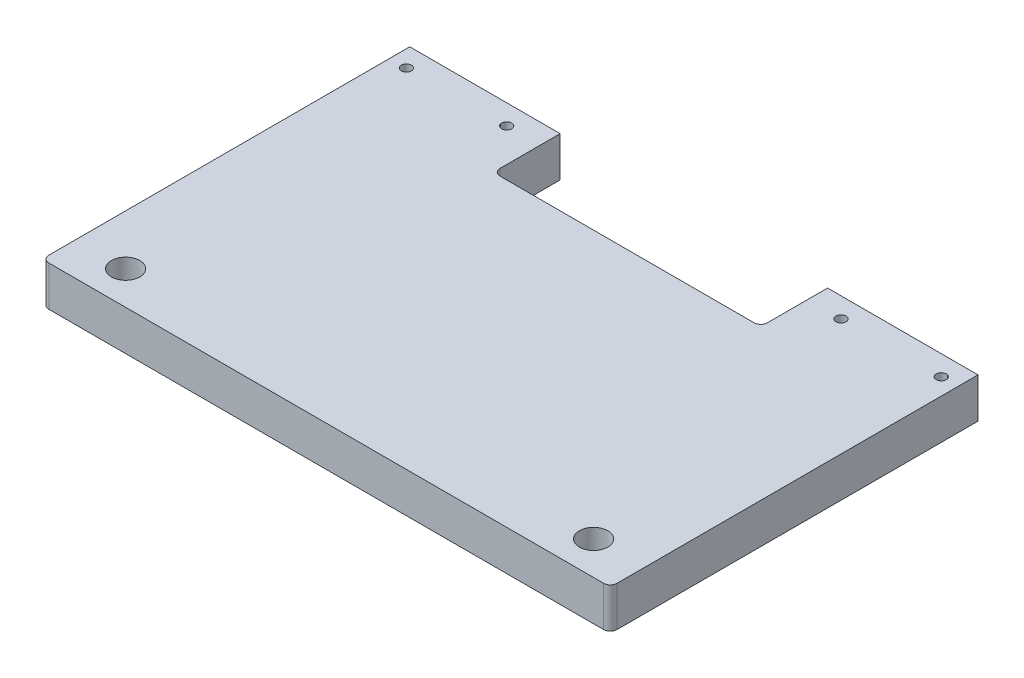
ISO-10303-21;
HEADER;
FILE_DESCRIPTION(('STEP AP214'),'2;1');
FILE_NAME('part.step','',(''),(''),'','','');
FILE_SCHEMA(('AUTOMOTIVE_DESIGN { 1 0 10303 214 1 1 1 1 }'));
ENDSEC;
DATA;
#1=APPLICATION_CONTEXT('core data for automotive mechanical design processes');
#2=APPLICATION_PROTOCOL_DEFINITION('international standard','automotive_design',2000,#1);
#3=PRODUCT_CONTEXT('',#1,'mechanical');
#4=PRODUCT('Part','Part','',(#3));
#5=PRODUCT_RELATED_PRODUCT_CATEGORY('part','',(#4));
#6=PRODUCT_DEFINITION_FORMATION('','',#4);
#7=PRODUCT_DEFINITION_CONTEXT('part definition',#1,'design');
#8=PRODUCT_DEFINITION('design','',#6,#7);
#9=PRODUCT_DEFINITION_SHAPE('','',#8);
#10=(LENGTH_UNIT() NAMED_UNIT(*) SI_UNIT(.MILLI.,.METRE.));
#11=(NAMED_UNIT(*) PLANE_ANGLE_UNIT() SI_UNIT($,.RADIAN.));
#12=(NAMED_UNIT(*) SI_UNIT($,.STERADIAN.) SOLID_ANGLE_UNIT());
#13=UNCERTAINTY_MEASURE_WITH_UNIT(LENGTH_MEASURE(1.E-05),#10,'distance_accuracy_value','');
#14=(GEOMETRIC_REPRESENTATION_CONTEXT(3) GLOBAL_UNCERTAINTY_ASSIGNED_CONTEXT((#13)) GLOBAL_UNIT_ASSIGNED_CONTEXT((#10,
#11,#12)) REPRESENTATION_CONTEXT('',''));
#15=CARTESIAN_POINT('',(0.,0.,0.));
#16=DIRECTION('',(0.,0.,1.));
#17=DIRECTION('',(1.,0.,0.));
#18=AXIS2_PLACEMENT_3D('',#15,#16,#17);
#19=CARTESIAN_POINT('',(0.,12.,0.));
#20=DIRECTION('',(0.,-1.,0.));
#21=DIRECTION('',(0.,0.,-1.));
#22=AXIS2_PLACEMENT_3D('',#19,#20,#21);
#23=PLANE('',#22);
#24=DIRECTION('',(1.,0.,0.));
#25=VECTOR('',#24,1.);
#26=CARTESIAN_POINT('',(0.,12.,0.));
#27=LINE('',#26,#25);
#28=CARTESIAN_POINT('',(2.,12.,0.));
#29=VERTEX_POINT('',#28);
#30=CARTESIAN_POINT('',(168.,12.,0.));
#31=VERTEX_POINT('',#30);
#32=EDGE_CURVE('E144',#29,#31,#27,.T.);
#33=ORIENTED_EDGE('',*,*,#32,.T.);
#34=CARTESIAN_POINT('',(168.,12.,-2.00000000000002));
#35=DIRECTION('',(0.,-1.,0.));
#36=DIRECTION('',(0.,0.,-1.));
#37=AXIS2_PLACEMENT_3D('',#34,#35,#36);
#38=CIRCLE('',#37,2.);
#39=CARTESIAN_POINT('',(170.,12.,-2.00000000000002));
#40=VERTEX_POINT('',#39);
#41=EDGE_CURVE('E140',#31,#40,#38,.F.);
#42=ORIENTED_EDGE('',*,*,#41,.T.);
#43=DIRECTION('',(0.,0.,-1.));
#44=VECTOR('',#43,1.);
#45=CARTESIAN_POINT('',(170.,12.,0.));
#46=LINE('',#45,#44);
#47=CARTESIAN_POINT('',(170.,12.,-110.));
#48=VERTEX_POINT('',#47);
#49=EDGE_CURVE('E132',#40,#48,#46,.T.);
#50=ORIENTED_EDGE('',*,*,#49,.T.);
#51=DIRECTION('',(-1.,0.,0.));
#52=VECTOR('',#51,1.);
#53=CARTESIAN_POINT('',(125.,12.,-110.));
#54=LINE('',#53,#52);
#55=CARTESIAN_POINT('',(125.,12.,-110.));
#56=VERTEX_POINT('',#55);
#57=EDGE_CURVE('E137',#48,#56,#54,.T.);
#58=ORIENTED_EDGE('',*,*,#57,.T.);
#59=DIRECTION('',(0.,0.,1.));
#60=VECTOR('',#59,1.);
#61=CARTESIAN_POINT('',(125.,12.,-90.));
#62=LINE('',#61,#60);
#63=CARTESIAN_POINT('',(125.,12.,-92.));
#64=VERTEX_POINT('',#63);
#65=EDGE_CURVE('E159',#56,#64,#62,.T.);
#66=ORIENTED_EDGE('',*,*,#65,.T.);
#67=CARTESIAN_POINT('',(123.,12.,-92.));
#68=DIRECTION('',(0.,-1.,0.));
#69=DIRECTION('',(0.,0.,-1.));
#70=AXIS2_PLACEMENT_3D('',#67,#68,#69);
#71=CIRCLE('',#70,2.);
#72=CARTESIAN_POINT('',(123.,12.,-90.));
#73=VERTEX_POINT('',#72);
#74=EDGE_CURVE('E222',#64,#73,#71,.T.);
#75=ORIENTED_EDGE('',*,*,#74,.T.);
#76=DIRECTION('',(-1.,0.,0.));
#77=VECTOR('',#76,1.);
#78=CARTESIAN_POINT('',(45.,12.,-90.));
#79=LINE('',#78,#77);
#80=CARTESIAN_POINT('',(47.,12.,-90.));
#81=VERTEX_POINT('',#80);
#82=EDGE_CURVE('E161',#73,#81,#79,.T.);
#83=ORIENTED_EDGE('',*,*,#82,.T.);
#84=CARTESIAN_POINT('',(47.,12.,-92.));
#85=DIRECTION('',(0.,-1.,0.));
#86=DIRECTION('',(0.,0.,-1.));
#87=AXIS2_PLACEMENT_3D('',#84,#85,#86);
#88=CIRCLE('',#87,2.);
#89=CARTESIAN_POINT('',(45.,12.,-92.));
#90=VERTEX_POINT('',#89);
#91=EDGE_CURVE('E12',#81,#90,#88,.T.);
#92=ORIENTED_EDGE('',*,*,#91,.T.);
#93=DIRECTION('',(0.,0.,-1.));
#94=VECTOR('',#93,1.);
#95=CARTESIAN_POINT('',(45.,12.,-110.));
#96=LINE('',#95,#94);
#97=CARTESIAN_POINT('',(45.,12.,-110.));
#98=VERTEX_POINT('',#97);
#99=EDGE_CURVE('E167',#90,#98,#96,.T.);
#100=ORIENTED_EDGE('',*,*,#99,.T.);
#101=DIRECTION('',(-1.,0.,0.));
#102=VECTOR('',#101,1.);
#103=CARTESIAN_POINT('',(0.,12.,-110.));
#104=LINE('',#103,#102);
#105=CARTESIAN_POINT('',(0.,12.,-110.));
#106=VERTEX_POINT('',#105);
#107=EDGE_CURVE('E169',#98,#106,#104,.T.);
#108=ORIENTED_EDGE('',*,*,#107,.T.);
#109=DIRECTION('',(0.,0.,1.));
#110=VECTOR('',#109,1.);
#111=CARTESIAN_POINT('',(0.,12.,0.));
#112=LINE('',#111,#110);
#113=CARTESIAN_POINT('',(0.,12.,-2.));
#114=VERTEX_POINT('',#113);
#115=EDGE_CURVE('E190',#106,#114,#112,.T.);
#116=ORIENTED_EDGE('',*,*,#115,.T.);
#117=CARTESIAN_POINT('',(2.,12.,-2.));
#118=DIRECTION('',(0.,-1.,0.));
#119=DIRECTION('',(0.,0.,-1.));
#120=AXIS2_PLACEMENT_3D('',#117,#118,#119);
#121=CIRCLE('',#120,2.);
#122=EDGE_CURVE('E216',#114,#29,#121,.F.);
#123=ORIENTED_EDGE('',*,*,#122,.T.);
#124=EDGE_LOOP('',(#33,#42,#50,#58,#66,#75,#83,#92,#100,#108,#116,#123));
#125=FACE_BOUND('',#124,.T.);
#126=CARTESIAN_POINT('',(155.,12.,-10.));
#127=DIRECTION('',(0.,1.,0.));
#128=DIRECTION('',(0.,0.,1.));
#129=AXIS2_PLACEMENT_3D('',#126,#127,#128);
#130=CIRCLE('',#129,4.25000000000001);
#131=CARTESIAN_POINT('',(155.,12.,-5.74999999999999));
#132=VERTEX_POINT('',#131);
#133=EDGE_CURVE('E175',#132,#132,#130,.T.);
#134=ORIENTED_EDGE('',*,*,#133,.F.);
#135=EDGE_LOOP('',(#134));
#136=FACE_BOUND('',#135,.T.);
#137=CARTESIAN_POINT('',(15.,12.,-10.));
#138=DIRECTION('',(0.,1.,0.));
#139=DIRECTION('',(0.,0.,-1.));
#140=AXIS2_PLACEMENT_3D('',#137,#138,#139);
#141=CIRCLE('',#140,4.25);
#142=CARTESIAN_POINT('',(15.,12.,-14.25));
#143=VERTEX_POINT('',#142);
#144=EDGE_CURVE('E326',#143,#143,#141,.T.);
#145=ORIENTED_EDGE('',*,*,#144,.F.);
#146=EDGE_LOOP('',(#145));
#147=FACE_BOUND('',#146,.T.);
#148=CARTESIAN_POINT('',(5.,12.,-104.));
#149=DIRECTION('',(0.,1.,0.));
#150=DIRECTION('',(0.,0.,1.));
#151=AXIS2_PLACEMENT_3D('',#148,#149,#150);
#152=CIRCLE('',#151,1.5);
#153=CARTESIAN_POINT('',(5.,12.,-102.5));
#154=VERTEX_POINT('',#153);
#155=EDGE_CURVE('E330',#154,#154,#152,.T.);
#156=ORIENTED_EDGE('',*,*,#155,.F.);
#157=EDGE_LOOP('',(#156));
#158=FACE_BOUND('',#157,.T.);
#159=CARTESIAN_POINT('',(35.,12.,-104.));
#160=DIRECTION('',(0.,1.,0.));
#161=DIRECTION('',(0.,0.,1.));
#162=AXIS2_PLACEMENT_3D('',#159,#160,#161);
#163=CIRCLE('',#162,1.5);
#164=CARTESIAN_POINT('',(35.,12.,-102.5));
#165=VERTEX_POINT('',#164);
#166=EDGE_CURVE('E399',#165,#165,#163,.T.);
#167=ORIENTED_EDGE('',*,*,#166,.F.);
#168=EDGE_LOOP('',(#167));
#169=FACE_BOUND('',#168,.T.);
#170=CARTESIAN_POINT('',(165.,12.,-104.));
#171=DIRECTION('',(0.,1.,0.));
#172=DIRECTION('',(0.,0.,-1.));
#173=AXIS2_PLACEMENT_3D('',#170,#171,#172);
#174=CIRCLE('',#173,1.5);
#175=CARTESIAN_POINT('',(165.,12.,-105.5));
#176=VERTEX_POINT('',#175);
#177=EDGE_CURVE('E361',#176,#176,#174,.T.);
#178=ORIENTED_EDGE('',*,*,#177,.F.);
#179=EDGE_LOOP('',(#178));
#180=FACE_BOUND('',#179,.T.);
#181=CARTESIAN_POINT('',(135.,12.,-104.));
#182=DIRECTION('',(0.,1.,0.));
#183=DIRECTION('',(0.,0.,-1.));
#184=AXIS2_PLACEMENT_3D('',#181,#182,#183);
#185=CIRCLE('',#184,1.5);
#186=CARTESIAN_POINT('',(135.,12.,-105.5));
#187=VERTEX_POINT('',#186);
#188=EDGE_CURVE('E379',#187,#187,#185,.T.);
#189=ORIENTED_EDGE('',*,*,#188,.F.);
#190=EDGE_LOOP('',(#189));
#191=FACE_BOUND('',#190,.T.);
#192=ADVANCED_FACE('F41',(#125,#136,#147,#158,#169,#180,#191),#23,.F.);
#193=CARTESIAN_POINT('',(0.,0.,0.));
#194=DIRECTION('',(0.,-1.,0.));
#195=DIRECTION('',(0.,0.,-1.));
#196=AXIS2_PLACEMENT_3D('',#193,#194,#195);
#197=PLANE('',#196);
#198=CARTESIAN_POINT('',(165.,0.,-104.));
#199=DIRECTION('',(0.,1.,0.));
#200=DIRECTION('',(0.,0.,-1.));
#201=AXIS2_PLACEMENT_3D('',#198,#199,#200);
#202=CIRCLE('',#201,1.5);
#203=CARTESIAN_POINT('',(165.,0.,-105.5));
#204=VERTEX_POINT('',#203);
#205=EDGE_CURVE('E368',#204,#204,#202,.T.);
#206=ORIENTED_EDGE('',*,*,#205,.T.);
#207=EDGE_LOOP('',(#206));
#208=FACE_BOUND('',#207,.T.);
#209=CARTESIAN_POINT('',(5.,0.,-104.));
#210=DIRECTION('',(0.,1.,0.));
#211=DIRECTION('',(0.,0.,1.));
#212=AXIS2_PLACEMENT_3D('',#209,#210,#211);
#213=CIRCLE('',#212,1.5);
#214=CARTESIAN_POINT('',(5.,0.,-102.5));
#215=VERTEX_POINT('',#214);
#216=EDGE_CURVE('E337',#215,#215,#213,.T.);
#217=ORIENTED_EDGE('',*,*,#216,.T.);
#218=EDGE_LOOP('',(#217));
#219=FACE_BOUND('',#218,.T.);
#220=CARTESIAN_POINT('',(155.,0.,-10.));
#221=DIRECTION('',(0.,1.,0.));
#222=DIRECTION('',(0.,0.,1.));
#223=AXIS2_PLACEMENT_3D('',#220,#221,#222);
#224=CIRCLE('',#223,4.25000000000001);
#225=CARTESIAN_POINT('',(155.,0.,-5.74999999999999));
#226=VERTEX_POINT('',#225);
#227=EDGE_CURVE('E333',#226,#226,#224,.T.);
#228=ORIENTED_EDGE('',*,*,#227,.T.);
#229=EDGE_LOOP('',(#228));
#230=FACE_BOUND('',#229,.T.);
#231=DIRECTION('',(0.,0.,-1.));
#232=VECTOR('',#231,1.);
#233=CARTESIAN_POINT('',(170.,0.,0.));
#234=LINE('',#233,#232);
#235=CARTESIAN_POINT('',(170.,0.,-2.00000000000002));
#236=VERTEX_POINT('',#235);
#237=CARTESIAN_POINT('',(170.,0.,-110.));
#238=VERTEX_POINT('',#237);
#239=EDGE_CURVE('E150',#236,#238,#234,.T.);
#240=ORIENTED_EDGE('',*,*,#239,.F.);
#241=CARTESIAN_POINT('',(168.,0.,-2.00000000000002));
#242=DIRECTION('',(0.,-1.,0.));
#243=DIRECTION('',(0.,0.,-1.));
#244=AXIS2_PLACEMENT_3D('',#241,#242,#243);
#245=CIRCLE('',#244,2.);
#246=CARTESIAN_POINT('',(168.,0.,0.));
#247=VERTEX_POINT('',#246);
#248=EDGE_CURVE('E210',#236,#247,#245,.T.);
#249=ORIENTED_EDGE('',*,*,#248,.T.);
#250=DIRECTION('',(1.,0.,0.));
#251=VECTOR('',#250,1.);
#252=CARTESIAN_POINT('',(0.,0.,0.));
#253=LINE('',#252,#251);
#254=CARTESIAN_POINT('',(2.,0.,0.));
#255=VERTEX_POINT('',#254);
#256=EDGE_CURVE('E174',#255,#247,#253,.T.);
#257=ORIENTED_EDGE('',*,*,#256,.F.);
#258=CARTESIAN_POINT('',(2.,0.,-2.));
#259=DIRECTION('',(0.,-1.,0.));
#260=DIRECTION('',(0.,0.,-1.));
#261=AXIS2_PLACEMENT_3D('',#258,#259,#260);
#262=CIRCLE('',#261,2.);
#263=CARTESIAN_POINT('',(0.,0.,-2.));
#264=VERTEX_POINT('',#263);
#265=EDGE_CURVE('E208',#255,#264,#262,.T.);
#266=ORIENTED_EDGE('',*,*,#265,.T.);
#267=DIRECTION('',(0.,0.,1.));
#268=VECTOR('',#267,1.);
#269=CARTESIAN_POINT('',(0.,0.,0.));
#270=LINE('',#269,#268);
#271=CARTESIAN_POINT('',(0.,0.,-110.));
#272=VERTEX_POINT('',#271);
#273=EDGE_CURVE('E172',#272,#264,#270,.T.);
#274=ORIENTED_EDGE('',*,*,#273,.F.);
#275=DIRECTION('',(-1.,0.,0.));
#276=VECTOR('',#275,1.);
#277=CARTESIAN_POINT('',(0.,0.,-110.));
#278=LINE('',#277,#276);
#279=CARTESIAN_POINT('',(45.,0.,-110.));
#280=VERTEX_POINT('',#279);
#281=EDGE_CURVE('E188',#280,#272,#278,.T.);
#282=ORIENTED_EDGE('',*,*,#281,.F.);
#283=DIRECTION('',(0.,0.,-1.));
#284=VECTOR('',#283,1.);
#285=CARTESIAN_POINT('',(45.,0.,-110.));
#286=LINE('',#285,#284);
#287=CARTESIAN_POINT('',(45.,0.,-92.));
#288=VERTEX_POINT('',#287);
#289=EDGE_CURVE('E186',#288,#280,#286,.T.);
#290=ORIENTED_EDGE('',*,*,#289,.F.);
#291=CARTESIAN_POINT('',(47.,0.,-92.));
#292=DIRECTION('',(0.,-1.,0.));
#293=DIRECTION('',(0.,0.,-1.));
#294=AXIS2_PLACEMENT_3D('',#291,#292,#293);
#295=CIRCLE('',#294,2.);
#296=CARTESIAN_POINT('',(47.,0.,-90.));
#297=VERTEX_POINT('',#296);
#298=EDGE_CURVE('E49',#288,#297,#295,.F.);
#299=ORIENTED_EDGE('',*,*,#298,.T.);
#300=DIRECTION('',(-1.,0.,0.));
#301=VECTOR('',#300,1.);
#302=CARTESIAN_POINT('',(45.,0.,-90.));
#303=LINE('',#302,#301);
#304=CARTESIAN_POINT('',(123.,0.,-90.));
#305=VERTEX_POINT('',#304);
#306=EDGE_CURVE('E183',#305,#297,#303,.T.);
#307=ORIENTED_EDGE('',*,*,#306,.F.);
#308=CARTESIAN_POINT('',(123.,0.,-92.));
#309=DIRECTION('',(0.,-1.,0.));
#310=DIRECTION('',(0.,0.,-1.));
#311=AXIS2_PLACEMENT_3D('',#308,#309,#310);
#312=CIRCLE('',#311,2.);
#313=CARTESIAN_POINT('',(125.,0.,-92.));
#314=VERTEX_POINT('',#313);
#315=EDGE_CURVE('E220',#305,#314,#312,.F.);
#316=ORIENTED_EDGE('',*,*,#315,.T.);
#317=DIRECTION('',(0.,0.,1.));
#318=VECTOR('',#317,1.);
#319=CARTESIAN_POINT('',(125.,0.,-90.));
#320=LINE('',#319,#318);
#321=CARTESIAN_POINT('',(125.,0.,-110.));
#322=VERTEX_POINT('',#321);
#323=EDGE_CURVE('E180',#322,#314,#320,.T.);
#324=ORIENTED_EDGE('',*,*,#323,.F.);
#325=DIRECTION('',(-1.,0.,0.));
#326=VECTOR('',#325,1.);
#327=CARTESIAN_POINT('',(125.,0.,-110.));
#328=LINE('',#327,#326);
#329=EDGE_CURVE('E178',#238,#322,#328,.T.);
#330=ORIENTED_EDGE('',*,*,#329,.F.);
#331=EDGE_LOOP('',(#240,#249,#257,#266,#274,#282,#290,#299,#307,#316,#324,#330));
#332=FACE_BOUND('',#331,.T.);
#333=CARTESIAN_POINT('',(15.,0.,-10.));
#334=DIRECTION('',(0.,1.,0.));
#335=DIRECTION('',(0.,0.,-1.));
#336=AXIS2_PLACEMENT_3D('',#333,#334,#335);
#337=CIRCLE('',#336,4.25);
#338=CARTESIAN_POINT('',(15.,0.,-14.25));
#339=VERTEX_POINT('',#338);
#340=EDGE_CURVE('E329',#339,#339,#337,.T.);
#341=ORIENTED_EDGE('',*,*,#340,.T.);
#342=EDGE_LOOP('',(#341));
#343=FACE_BOUND('',#342,.T.);
#344=CARTESIAN_POINT('',(35.,0.,-104.));
#345=DIRECTION('',(0.,1.,0.));
#346=DIRECTION('',(0.,0.,1.));
#347=AXIS2_PLACEMENT_3D('',#344,#345,#346);
#348=CIRCLE('',#347,1.5);
#349=CARTESIAN_POINT('',(35.,0.,-102.5));
#350=VERTEX_POINT('',#349);
#351=EDGE_CURVE('E367',#350,#350,#348,.T.);
#352=ORIENTED_EDGE('',*,*,#351,.T.);
#353=EDGE_LOOP('',(#352));
#354=FACE_BOUND('',#353,.T.);
#355=CARTESIAN_POINT('',(135.,0.,-104.));
#356=DIRECTION('',(0.,1.,0.));
#357=DIRECTION('',(0.,0.,-1.));
#358=AXIS2_PLACEMENT_3D('',#355,#356,#357);
#359=CIRCLE('',#358,1.5);
#360=CARTESIAN_POINT('',(135.,0.,-105.5));
#361=VERTEX_POINT('',#360);
#362=EDGE_CURVE('E369',#361,#361,#359,.T.);
#363=ORIENTED_EDGE('',*,*,#362,.T.);
#364=EDGE_LOOP('',(#363));
#365=FACE_BOUND('',#364,.T.);
#366=ADVANCED_FACE('F226',(#208,#219,#230,#332,#343,#354,#365),#197,.T.);
#367=CARTESIAN_POINT('',(0.,12.,0.));
#368=DIRECTION('',(1.,0.,0.));
#369=DIRECTION('',(0.,0.,-1.));
#370=AXIS2_PLACEMENT_3D('',#367,#368,#369);
#371=PLANE('',#370);
#372=ORIENTED_EDGE('',*,*,#273,.T.);
#373=DIRECTION('',(0.,-1.,0.));
#374=VECTOR('',#373,1.);
#375=CARTESIAN_POINT('',(0.,12.,-2.));
#376=LINE('',#375,#374);
#377=EDGE_CURVE('E56',#264,#114,#376,.F.);
#378=ORIENTED_EDGE('',*,*,#377,.T.);
#379=ORIENTED_EDGE('',*,*,#115,.F.);
#380=DIRECTION('',(0.,-1.,0.));
#381=VECTOR('',#380,1.);
#382=CARTESIAN_POINT('',(0.,12.,-110.));
#383=LINE('',#382,#381);
#384=EDGE_CURVE('E171',#106,#272,#383,.T.);
#385=ORIENTED_EDGE('',*,*,#384,.T.);
#386=EDGE_LOOP('',(#372,#378,#379,#385));
#387=FACE_BOUND('',#386,.T.);
#388=ADVANCED_FACE('F267',(#387),#371,.F.);
#389=CARTESIAN_POINT('',(0.,12.,0.));
#390=DIRECTION('',(0.,0.,-1.));
#391=DIRECTION('',(-1.,0.,0.));
#392=AXIS2_PLACEMENT_3D('',#389,#390,#391);
#393=PLANE('',#392);
#394=ORIENTED_EDGE('',*,*,#256,.T.);
#395=DIRECTION('',(0.,-1.,0.));
#396=VECTOR('',#395,1.);
#397=CARTESIAN_POINT('',(168.,12.,0.));
#398=LINE('',#397,#396);
#399=EDGE_CURVE('E64',#247,#31,#398,.F.);
#400=ORIENTED_EDGE('',*,*,#399,.T.);
#401=ORIENTED_EDGE('',*,*,#32,.F.);
#402=DIRECTION('',(0.,-1.,0.));
#403=VECTOR('',#402,1.);
#404=CARTESIAN_POINT('',(2.,12.,0.));
#405=LINE('',#404,#403);
#406=EDGE_CURVE('E212',#29,#255,#405,.T.);
#407=ORIENTED_EDGE('',*,*,#406,.T.);
#408=EDGE_LOOP('',(#394,#400,#401,#407));
#409=FACE_BOUND('',#408,.T.);
#410=ADVANCED_FACE('F251',(#409),#393,.F.);
#411=CARTESIAN_POINT('',(170.,12.,0.));
#412=DIRECTION('',(-1.,0.,0.));
#413=DIRECTION('',(0.,0.,1.));
#414=AXIS2_PLACEMENT_3D('',#411,#412,#413);
#415=PLANE('',#414);
#416=ORIENTED_EDGE('',*,*,#49,.F.);
#417=DIRECTION('',(0.,-1.,0.));
#418=VECTOR('',#417,1.);
#419=CARTESIAN_POINT('',(170.,12.,-2.00000000000002));
#420=LINE('',#419,#418);
#421=EDGE_CURVE('E206',#40,#236,#420,.T.);
#422=ORIENTED_EDGE('',*,*,#421,.T.);
#423=ORIENTED_EDGE('',*,*,#239,.T.);
#424=DIRECTION('',(0.,-1.,0.));
#425=VECTOR('',#424,1.);
#426=CARTESIAN_POINT('',(170.,12.,-110.));
#427=LINE('',#426,#425);
#428=EDGE_CURVE('E147',#48,#238,#427,.T.);
#429=ORIENTED_EDGE('',*,*,#428,.F.);
#430=EDGE_LOOP('',(#416,#422,#423,#429));
#431=FACE_BOUND('',#430,.T.);
#432=ADVANCED_FACE('F148',(#431),#415,.F.);
#433=CARTESIAN_POINT('',(125.,12.,-110.));
#434=DIRECTION('',(0.,0.,1.));
#435=DIRECTION('',(1.,0.,0.));
#436=AXIS2_PLACEMENT_3D('',#433,#434,#435);
#437=PLANE('',#436);
#438=ORIENTED_EDGE('',*,*,#329,.T.);
#439=DIRECTION('',(0.,-1.,0.));
#440=VECTOR('',#439,1.);
#441=CARTESIAN_POINT('',(125.,12.,-110.));
#442=LINE('',#441,#440);
#443=EDGE_CURVE('E154',#56,#322,#442,.T.);
#444=ORIENTED_EDGE('',*,*,#443,.F.);
#445=ORIENTED_EDGE('',*,*,#57,.F.);
#446=ORIENTED_EDGE('',*,*,#428,.T.);
#447=EDGE_LOOP('',(#438,#444,#445,#446));
#448=FACE_BOUND('',#447,.T.);
#449=ADVANCED_FACE('F156',(#448),#437,.F.);
#450=CARTESIAN_POINT('',(125.,12.,-90.));
#451=DIRECTION('',(1.,0.,0.));
#452=DIRECTION('',(0.,0.,-1.));
#453=AXIS2_PLACEMENT_3D('',#450,#451,#452);
#454=PLANE('',#453);
#455=ORIENTED_EDGE('',*,*,#323,.T.);
#456=DIRECTION('',(0.,-1.,0.));
#457=VECTOR('',#456,1.);
#458=CARTESIAN_POINT('',(125.,12.,-92.));
#459=LINE('',#458,#457);
#460=EDGE_CURVE('E201',#314,#64,#459,.F.);
#461=ORIENTED_EDGE('',*,*,#460,.T.);
#462=ORIENTED_EDGE('',*,*,#65,.F.);
#463=ORIENTED_EDGE('',*,*,#443,.T.);
#464=EDGE_LOOP('',(#455,#461,#462,#463));
#465=FACE_BOUND('',#464,.T.);
#466=ADVANCED_FACE('F280',(#465),#454,.F.);
#467=CARTESIAN_POINT('',(45.,12.,-90.));
#468=DIRECTION('',(0.,0.,1.));
#469=DIRECTION('',(1.,0.,0.));
#470=AXIS2_PLACEMENT_3D('',#467,#468,#469);
#471=PLANE('',#470);
#472=ORIENTED_EDGE('',*,*,#82,.F.);
#473=DIRECTION('',(0.,-1.,0.));
#474=VECTOR('',#473,1.);
#475=CARTESIAN_POINT('',(123.,0.,-90.));
#476=LINE('',#475,#474);
#477=EDGE_CURVE('E198',#73,#305,#476,.T.);
#478=ORIENTED_EDGE('',*,*,#477,.T.);
#479=ORIENTED_EDGE('',*,*,#306,.T.);
#480=DIRECTION('',(0.,-1.,0.));
#481=VECTOR('',#480,1.);
#482=CARTESIAN_POINT('',(47.,12.,-90.));
#483=LINE('',#482,#481);
#484=EDGE_CURVE('E153',#297,#81,#483,.F.);
#485=ORIENTED_EDGE('',*,*,#484,.T.);
#486=EDGE_LOOP('',(#472,#478,#479,#485));
#487=FACE_BOUND('',#486,.T.);
#488=ADVANCED_FACE('F234',(#487),#471,.F.);
#489=CARTESIAN_POINT('',(45.,12.,-110.));
#490=DIRECTION('',(-1.,0.,0.));
#491=DIRECTION('',(0.,0.,1.));
#492=AXIS2_PLACEMENT_3D('',#489,#490,#491);
#493=PLANE('',#492);
#494=ORIENTED_EDGE('',*,*,#99,.F.);
#495=DIRECTION('',(0.,-1.,0.));
#496=VECTOR('',#495,1.);
#497=CARTESIAN_POINT('',(45.,0.,-92.));
#498=LINE('',#497,#496);
#499=EDGE_CURVE('E203',#90,#288,#498,.T.);
#500=ORIENTED_EDGE('',*,*,#499,.T.);
#501=ORIENTED_EDGE('',*,*,#289,.T.);
#502=DIRECTION('',(0.,-1.,0.));
#503=VECTOR('',#502,1.);
#504=CARTESIAN_POINT('',(45.,12.,-110.));
#505=LINE('',#504,#503);
#506=EDGE_CURVE('E193',#98,#280,#505,.T.);
#507=ORIENTED_EDGE('',*,*,#506,.F.);
#508=EDGE_LOOP('',(#494,#500,#501,#507));
#509=FACE_BOUND('',#508,.T.);
#510=ADVANCED_FACE('F241',(#509),#493,.F.);
#511=CARTESIAN_POINT('',(0.,12.,-110.));
#512=DIRECTION('',(0.,0.,1.));
#513=DIRECTION('',(1.,0.,0.));
#514=AXIS2_PLACEMENT_3D('',#511,#512,#513);
#515=PLANE('',#514);
#516=ORIENTED_EDGE('',*,*,#281,.T.);
#517=ORIENTED_EDGE('',*,*,#384,.F.);
#518=ORIENTED_EDGE('',*,*,#107,.F.);
#519=ORIENTED_EDGE('',*,*,#506,.T.);
#520=EDGE_LOOP('',(#516,#517,#518,#519));
#521=FACE_BOUND('',#520,.T.);
#522=ADVANCED_FACE('F245',(#521),#515,.F.);
#523=CARTESIAN_POINT('',(155.,12.,-10.));
#524=DIRECTION('',(0.,-1.,0.));
#525=DIRECTION('',(0.,0.,-1.));
#526=AXIS2_PLACEMENT_3D('',#523,#524,#525);
#527=CYLINDRICAL_SURFACE('',#526,4.25000000000001);
#528=ORIENTED_EDGE('',*,*,#133,.T.);
#529=EDGE_LOOP('',(#528));
#530=FACE_BOUND('',#529,.T.);
#531=ORIENTED_EDGE('',*,*,#227,.F.);
#532=EDGE_LOOP('',(#531));
#533=FACE_BOUND('',#532,.T.);
#534=ADVANCED_FACE('F271',(#530,#533),#527,.F.);
#535=CARTESIAN_POINT('',(15.,12.,-10.));
#536=DIRECTION('',(0.,-1.,0.));
#537=DIRECTION('',(0.,0.,-1.));
#538=AXIS2_PLACEMENT_3D('',#535,#536,#537);
#539=CYLINDRICAL_SURFACE('',#538,4.25);
#540=ORIENTED_EDGE('',*,*,#144,.T.);
#541=EDGE_LOOP('',(#540));
#542=FACE_BOUND('',#541,.T.);
#543=ORIENTED_EDGE('',*,*,#340,.F.);
#544=EDGE_LOOP('',(#543));
#545=FACE_BOUND('',#544,.T.);
#546=ADVANCED_FACE('F316',(#542,#545),#539,.F.);
#547=CARTESIAN_POINT('',(5.,12.,-104.));
#548=DIRECTION('',(0.,-1.,0.));
#549=DIRECTION('',(0.,0.,-1.));
#550=AXIS2_PLACEMENT_3D('',#547,#548,#549);
#551=CYLINDRICAL_SURFACE('',#550,1.5);
#552=ORIENTED_EDGE('',*,*,#155,.T.);
#553=EDGE_LOOP('',(#552));
#554=FACE_BOUND('',#553,.T.);
#555=ORIENTED_EDGE('',*,*,#216,.F.);
#556=EDGE_LOOP('',(#555));
#557=FACE_BOUND('',#556,.T.);
#558=ADVANCED_FACE('F313',(#554,#557),#551,.F.);
#559=CARTESIAN_POINT('',(35.,12.,-104.));
#560=DIRECTION('',(0.,-1.,0.));
#561=DIRECTION('',(0.,0.,-1.));
#562=AXIS2_PLACEMENT_3D('',#559,#560,#561);
#563=CYLINDRICAL_SURFACE('',#562,1.5);
#564=ORIENTED_EDGE('',*,*,#166,.T.);
#565=EDGE_LOOP('',(#564));
#566=FACE_BOUND('',#565,.T.);
#567=ORIENTED_EDGE('',*,*,#351,.F.);
#568=EDGE_LOOP('',(#567));
#569=FACE_BOUND('',#568,.T.);
#570=ADVANCED_FACE('F305',(#566,#569),#563,.F.);
#571=CARTESIAN_POINT('',(165.,12.,-104.));
#572=DIRECTION('',(0.,-1.,0.));
#573=DIRECTION('',(0.,0.,-1.));
#574=AXIS2_PLACEMENT_3D('',#571,#572,#573);
#575=CYLINDRICAL_SURFACE('',#574,1.5);
#576=ORIENTED_EDGE('',*,*,#177,.T.);
#577=EDGE_LOOP('',(#576));
#578=FACE_BOUND('',#577,.T.);
#579=ORIENTED_EDGE('',*,*,#205,.F.);
#580=EDGE_LOOP('',(#579));
#581=FACE_BOUND('',#580,.T.);
#582=ADVANCED_FACE('F297',(#578,#581),#575,.F.);
#583=CARTESIAN_POINT('',(135.,12.,-104.));
#584=DIRECTION('',(0.,-1.,0.));
#585=DIRECTION('',(0.,0.,-1.));
#586=AXIS2_PLACEMENT_3D('',#583,#584,#585);
#587=CYLINDRICAL_SURFACE('',#586,1.5);
#588=ORIENTED_EDGE('',*,*,#188,.T.);
#589=EDGE_LOOP('',(#588));
#590=FACE_BOUND('',#589,.T.);
#591=ORIENTED_EDGE('',*,*,#362,.F.);
#592=EDGE_LOOP('',(#591));
#593=FACE_BOUND('',#592,.T.);
#594=ADVANCED_FACE('F293',(#590,#593),#587,.F.);
#595=CARTESIAN_POINT('',(123.,12.,-92.));
#596=DIRECTION('',(0.,1.,0.));
#597=DIRECTION('',(0.,0.,1.));
#598=AXIS2_PLACEMENT_3D('',#595,#596,#597);
#599=CYLINDRICAL_SURFACE('',#598,2.);
#600=ORIENTED_EDGE('',*,*,#74,.F.);
#601=ORIENTED_EDGE('',*,*,#460,.F.);
#602=ORIENTED_EDGE('',*,*,#315,.F.);
#603=ORIENTED_EDGE('',*,*,#477,.F.);
#604=EDGE_LOOP('',(#600,#601,#602,#603));
#605=FACE_BOUND('',#604,.T.);
#606=ADVANCED_FACE('F261',(#605),#599,.F.);
#607=CARTESIAN_POINT('',(47.,12.,-92.));
#608=DIRECTION('',(0.,1.,0.));
#609=DIRECTION('',(0.,0.,1.));
#610=AXIS2_PLACEMENT_3D('',#607,#608,#609);
#611=CYLINDRICAL_SURFACE('',#610,2.);
#612=ORIENTED_EDGE('',*,*,#91,.F.);
#613=ORIENTED_EDGE('',*,*,#484,.F.);
#614=ORIENTED_EDGE('',*,*,#298,.F.);
#615=ORIENTED_EDGE('',*,*,#499,.F.);
#616=EDGE_LOOP('',(#612,#613,#614,#615));
#617=FACE_BOUND('',#616,.T.);
#618=ADVANCED_FACE('F237',(#617),#611,.F.);
#619=CARTESIAN_POINT('',(168.,12.,-2.00000000000002));
#620=DIRECTION('',(0.,-1.,0.));
#621=DIRECTION('',(0.,0.,-1.));
#622=AXIS2_PLACEMENT_3D('',#619,#620,#621);
#623=CYLINDRICAL_SURFACE('',#622,2.);
#624=ORIENTED_EDGE('',*,*,#41,.F.);
#625=ORIENTED_EDGE('',*,*,#399,.F.);
#626=ORIENTED_EDGE('',*,*,#248,.F.);
#627=ORIENTED_EDGE('',*,*,#421,.F.);
#628=EDGE_LOOP('',(#624,#625,#626,#627));
#629=FACE_BOUND('',#628,.T.);
#630=ADVANCED_FACE('F254',(#629),#623,.T.);
#631=CARTESIAN_POINT('',(2.,12.,-2.));
#632=DIRECTION('',(0.,-1.,0.));
#633=DIRECTION('',(0.,0.,-1.));
#634=AXIS2_PLACEMENT_3D('',#631,#632,#633);
#635=CYLINDRICAL_SURFACE('',#634,2.);
#636=ORIENTED_EDGE('',*,*,#122,.F.);
#637=ORIENTED_EDGE('',*,*,#377,.F.);
#638=ORIENTED_EDGE('',*,*,#265,.F.);
#639=ORIENTED_EDGE('',*,*,#406,.F.);
#640=EDGE_LOOP('',(#636,#637,#638,#639));
#641=FACE_BOUND('',#640,.T.);
#642=ADVANCED_FACE('F43',(#641),#635,.T.);
#643=CLOSED_SHELL('',(#192,#366,#388,#410,#432,#449,#466,#488,#510,#522,#534,#546,#558,#570,
#582,#594,#606,#618,#630,#642));
#644=MANIFOLD_SOLID_BREP('B2',#643);
#645=ADVANCED_BREP_SHAPE_REPRESENTATION('',(#18,#644),#14);
#646=SHAPE_DEFINITION_REPRESENTATION(#9,#645);
ENDSEC;
END-ISO-10303-21;
